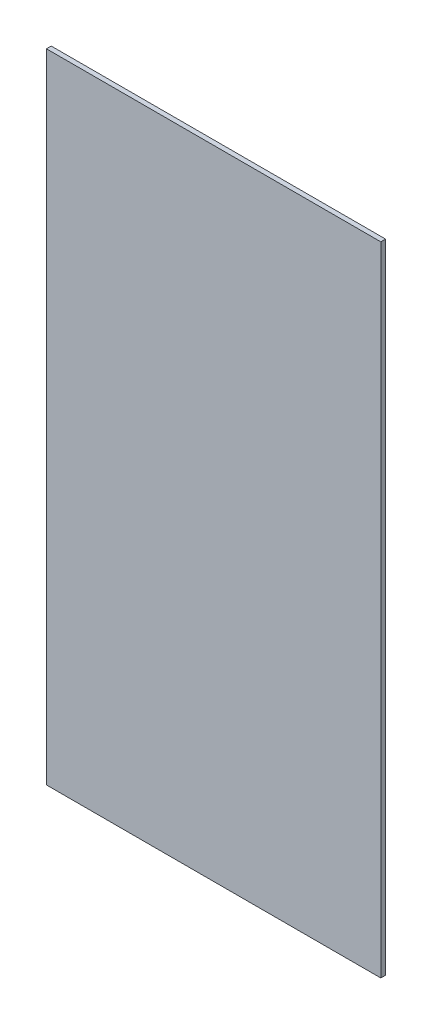
ISO-10303-21;
HEADER;
FILE_DESCRIPTION(('STEP AP214'),'2;1');
FILE_NAME('part.step','',(''),(''),'','','');
FILE_SCHEMA(('AUTOMOTIVE_DESIGN { 1 0 10303 214 1 1 1 1 }'));
ENDSEC;
DATA;
#1=APPLICATION_CONTEXT('core data for automotive mechanical design processes');
#2=APPLICATION_PROTOCOL_DEFINITION('international standard','automotive_design',2000,#1);
#3=PRODUCT_CONTEXT('',#1,'mechanical');
#4=PRODUCT('Part','Part','',(#3));
#5=PRODUCT_RELATED_PRODUCT_CATEGORY('part','',(#4));
#6=PRODUCT_DEFINITION_FORMATION('','',#4);
#7=PRODUCT_DEFINITION_CONTEXT('part definition',#1,'design');
#8=PRODUCT_DEFINITION('design','',#6,#7);
#9=PRODUCT_DEFINITION_SHAPE('','',#8);
#10=(LENGTH_UNIT() NAMED_UNIT(*) SI_UNIT(.MILLI.,.METRE.));
#11=(NAMED_UNIT(*) PLANE_ANGLE_UNIT() SI_UNIT($,.RADIAN.));
#12=(NAMED_UNIT(*) SI_UNIT($,.STERADIAN.) SOLID_ANGLE_UNIT());
#13=UNCERTAINTY_MEASURE_WITH_UNIT(LENGTH_MEASURE(1.E-05),#10,'distance_accuracy_value','');
#14=(GEOMETRIC_REPRESENTATION_CONTEXT(3) GLOBAL_UNCERTAINTY_ASSIGNED_CONTEXT((#13)) GLOBAL_UNIT_ASSIGNED_CONTEXT((#10,
#11,#12)) REPRESENTATION_CONTEXT('',''));
#15=CARTESIAN_POINT('',(0.,0.,0.));
#16=DIRECTION('',(0.,0.,1.));
#17=DIRECTION('',(1.,0.,0.));
#18=AXIS2_PLACEMENT_3D('',#15,#16,#17);
#19=CARTESIAN_POINT('',(-144.788214556006,533.,2.34139210268123));
#20=DIRECTION('',(1.,0.,0.));
#21=DIRECTION('',(0.,0.,-1.));
#22=AXIS2_PLACEMENT_3D('',#19,#20,#21);
#23=PLANE('',#22);
#24=DIRECTION('',(0.,0.,1.));
#25=VECTOR('',#24,1.);
#26=CARTESIAN_POINT('',(-144.788214556006,0.,2.34139210268123));
#27=LINE('',#26,#25);
#28=CARTESIAN_POINT('',(-144.788214556006,0.,2.34139210268123));
#29=VERTEX_POINT('',#28);
#30=CARTESIAN_POINT('',(-144.788214556006,0.,6.34139210268123));
#31=VERTEX_POINT('',#30);
#32=EDGE_CURVE('E96',#29,#31,#27,.T.);
#33=ORIENTED_EDGE('',*,*,#32,.T.);
#34=DIRECTION('',(0.,-1.,0.));
#35=VECTOR('',#34,1.);
#36=CARTESIAN_POINT('',(-144.788214556006,533.,6.34139210268123));
#37=LINE('',#36,#35);
#38=CARTESIAN_POINT('',(-144.788214556006,533.,6.34139210268123));
#39=VERTEX_POINT('',#38);
#40=EDGE_CURVE('E11',#39,#31,#37,.T.);
#41=ORIENTED_EDGE('',*,*,#40,.F.);
#42=DIRECTION('',(0.,0.,1.));
#43=VECTOR('',#42,1.);
#44=CARTESIAN_POINT('',(-144.788214556006,533.,2.34139210268123));
#45=LINE('',#44,#43);
#46=CARTESIAN_POINT('',(-144.788214556006,533.,2.34139210268123));
#47=VERTEX_POINT('',#46);
#48=EDGE_CURVE('E84',#47,#39,#45,.T.);
#49=ORIENTED_EDGE('',*,*,#48,.F.);
#50=DIRECTION('',(0.,-1.,0.));
#51=VECTOR('',#50,1.);
#52=CARTESIAN_POINT('',(-144.788214556006,533.,2.34139210268123));
#53=LINE('',#52,#51);
#54=EDGE_CURVE('E92',#47,#29,#53,.T.);
#55=ORIENTED_EDGE('',*,*,#54,.T.);
#56=EDGE_LOOP('',(#33,#41,#49,#55));
#57=FACE_BOUND('',#56,.T.);
#58=ADVANCED_FACE('F33',(#57),#23,.F.);
#59=CARTESIAN_POINT('',(-144.788214556006,533.,6.34139210268123));
#60=DIRECTION('',(0.,0.,-1.));
#61=DIRECTION('',(-1.,0.,0.));
#62=AXIS2_PLACEMENT_3D('',#59,#60,#61);
#63=PLANE('',#62);
#64=DIRECTION('',(1.,0.,0.));
#65=VECTOR('',#64,1.);
#66=CARTESIAN_POINT('',(-144.788214556006,0.,6.34139210268123));
#67=LINE('',#66,#65);
#68=CARTESIAN_POINT('',(134.788312991033,0.,6.34139210268123));
#69=VERTEX_POINT('',#68);
#70=EDGE_CURVE('E88',#31,#69,#67,.T.);
#71=ORIENTED_EDGE('',*,*,#70,.T.);
#72=DIRECTION('',(0.,-1.,0.));
#73=VECTOR('',#72,1.);
#74=CARTESIAN_POINT('',(134.788312991033,533.,6.34139210268123));
#75=LINE('',#74,#73);
#76=CARTESIAN_POINT('',(134.788312991033,533.,6.34139210268123));
#77=VERTEX_POINT('',#76);
#78=EDGE_CURVE('E41',#77,#69,#75,.T.);
#79=ORIENTED_EDGE('',*,*,#78,.F.);
#80=DIRECTION('',(1.,0.,0.));
#81=VECTOR('',#80,1.);
#82=CARTESIAN_POINT('',(-144.788214556006,533.,6.34139210268123));
#83=LINE('',#82,#81);
#84=EDGE_CURVE('E79',#39,#77,#83,.T.);
#85=ORIENTED_EDGE('',*,*,#84,.F.);
#86=ORIENTED_EDGE('',*,*,#40,.T.);
#87=EDGE_LOOP('',(#71,#79,#85,#86));
#88=FACE_BOUND('',#87,.T.);
#89=ADVANCED_FACE('F87',(#88),#63,.F.);
#90=CARTESIAN_POINT('',(134.788312991033,533.,2.34139210268123));
#91=DIRECTION('',(-1.,0.,0.));
#92=DIRECTION('',(0.,0.,1.));
#93=AXIS2_PLACEMENT_3D('',#90,#91,#92);
#94=PLANE('',#93);
#95=DIRECTION('',(0.,0.,-1.));
#96=VECTOR('',#95,1.);
#97=CARTESIAN_POINT('',(134.788312991033,0.,2.34139210268123));
#98=LINE('',#97,#96);
#99=CARTESIAN_POINT('',(134.788312991033,0.,2.34139210268123));
#100=VERTEX_POINT('',#99);
#101=EDGE_CURVE('E66',#69,#100,#98,.T.);
#102=ORIENTED_EDGE('',*,*,#101,.T.);
#103=DIRECTION('',(0.,-1.,0.));
#104=VECTOR('',#103,1.);
#105=CARTESIAN_POINT('',(134.788312991033,533.,2.34139210268123));
#106=LINE('',#105,#104);
#107=CARTESIAN_POINT('',(134.788312991033,533.,2.34139210268123));
#108=VERTEX_POINT('',#107);
#109=EDGE_CURVE('E89',#108,#100,#106,.T.);
#110=ORIENTED_EDGE('',*,*,#109,.F.);
#111=DIRECTION('',(0.,0.,-1.));
#112=VECTOR('',#111,1.);
#113=CARTESIAN_POINT('',(134.788312991033,533.,2.34139210268123));
#114=LINE('',#113,#112);
#115=EDGE_CURVE('E82',#77,#108,#114,.T.);
#116=ORIENTED_EDGE('',*,*,#115,.F.);
#117=ORIENTED_EDGE('',*,*,#78,.T.);
#118=EDGE_LOOP('',(#102,#110,#116,#117));
#119=FACE_BOUND('',#118,.T.);
#120=ADVANCED_FACE('F90',(#119),#94,.F.);
#121=CARTESIAN_POINT('',(-144.788214556006,533.,2.34139210268123));
#122=DIRECTION('',(0.,0.,1.));
#123=DIRECTION('',(1.,0.,0.));
#124=AXIS2_PLACEMENT_3D('',#121,#122,#123);
#125=PLANE('',#124);
#126=DIRECTION('',(-1.,0.,0.));
#127=VECTOR('',#126,1.);
#128=CARTESIAN_POINT('',(-144.788214556006,0.,2.34139210268123));
#129=LINE('',#128,#127);
#130=EDGE_CURVE('E72',#100,#29,#129,.T.);
#131=ORIENTED_EDGE('',*,*,#130,.T.);
#132=ORIENTED_EDGE('',*,*,#54,.F.);
#133=DIRECTION('',(-1.,0.,0.));
#134=VECTOR('',#133,1.);
#135=CARTESIAN_POINT('',(-144.788214556006,533.,2.34139210268123));
#136=LINE('',#135,#134);
#137=EDGE_CURVE('E49',#108,#47,#136,.T.);
#138=ORIENTED_EDGE('',*,*,#137,.F.);
#139=ORIENTED_EDGE('',*,*,#109,.T.);
#140=EDGE_LOOP('',(#131,#132,#138,#139));
#141=FACE_BOUND('',#140,.T.);
#142=ADVANCED_FACE('F103',(#141),#125,.F.);
#143=CARTESIAN_POINT('',(-144.788214556006,533.,6.34139210268123));
#144=DIRECTION('',(0.,1.,0.));
#145=DIRECTION('',(0.,0.,1.));
#146=AXIS2_PLACEMENT_3D('',#143,#144,#145);
#147=PLANE('',#146);
#148=ORIENTED_EDGE('',*,*,#48,.T.);
#149=ORIENTED_EDGE('',*,*,#84,.T.);
#150=ORIENTED_EDGE('',*,*,#115,.T.);
#151=ORIENTED_EDGE('',*,*,#137,.T.);
#152=EDGE_LOOP('',(#148,#149,#150,#151));
#153=FACE_BOUND('',#152,.T.);
#154=ADVANCED_FACE('F80',(#153),#147,.T.);
#155=CARTESIAN_POINT('',(-144.788214556006,0.,6.34139210268123));
#156=DIRECTION('',(0.,1.,0.));
#157=DIRECTION('',(0.,0.,1.));
#158=AXIS2_PLACEMENT_3D('',#155,#156,#157);
#159=PLANE('',#158);
#160=ORIENTED_EDGE('',*,*,#32,.F.);
#161=ORIENTED_EDGE('',*,*,#130,.F.);
#162=ORIENTED_EDGE('',*,*,#101,.F.);
#163=ORIENTED_EDGE('',*,*,#70,.F.);
#164=EDGE_LOOP('',(#160,#161,#162,#163));
#165=FACE_BOUND('',#164,.T.);
#166=ADVANCED_FACE('F106',(#165),#159,.F.);
#167=CLOSED_SHELL('',(#58,#89,#120,#142,#154,#166));
#168=MANIFOLD_SOLID_BREP('B2',#167);
#169=ADVANCED_BREP_SHAPE_REPRESENTATION('',(#18,#168),#14);
#170=SHAPE_DEFINITION_REPRESENTATION(#9,#169);
ENDSEC;
END-ISO-10303-21;
